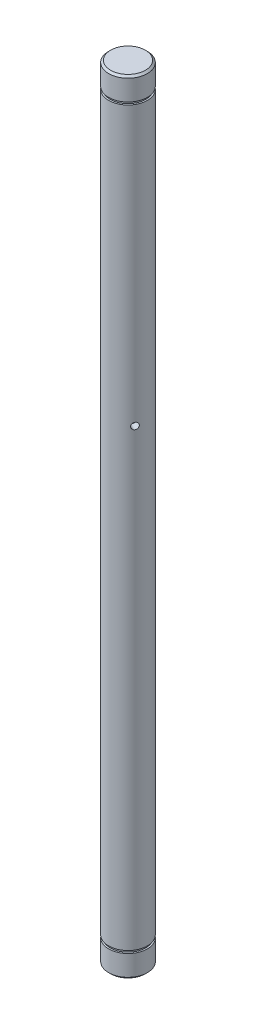
ISO-10303-21;
HEADER;
FILE_DESCRIPTION(('STEP AP214'),'2;1');
FILE_NAME('part.step','',(''),(''),'','','');
FILE_SCHEMA(('AUTOMOTIVE_DESIGN { 1 0 10303 214 1 1 1 1 }'));
ENDSEC;
DATA;
#1=APPLICATION_CONTEXT('core data for automotive mechanical design processes');
#2=APPLICATION_PROTOCOL_DEFINITION('international standard','automotive_design',2000,#1);
#3=PRODUCT_CONTEXT('',#1,'mechanical');
#4=PRODUCT('Part','Part','',(#3));
#5=PRODUCT_RELATED_PRODUCT_CATEGORY('part','',(#4));
#6=PRODUCT_DEFINITION_FORMATION('','',#4);
#7=PRODUCT_DEFINITION_CONTEXT('part definition',#1,'design');
#8=PRODUCT_DEFINITION('design','',#6,#7);
#9=PRODUCT_DEFINITION_SHAPE('','',#8);
#10=(LENGTH_UNIT() NAMED_UNIT(*) SI_UNIT(.MILLI.,.METRE.));
#11=(NAMED_UNIT(*) PLANE_ANGLE_UNIT() SI_UNIT($,.RADIAN.));
#12=(NAMED_UNIT(*) SI_UNIT($,.STERADIAN.) SOLID_ANGLE_UNIT());
#13=UNCERTAINTY_MEASURE_WITH_UNIT(LENGTH_MEASURE(1.E-05),#10,'distance_accuracy_value','');
#14=(GEOMETRIC_REPRESENTATION_CONTEXT(3) GLOBAL_UNCERTAINTY_ASSIGNED_CONTEXT((#13)) GLOBAL_UNIT_ASSIGNED_CONTEXT((#10,
#11,#12)) REPRESENTATION_CONTEXT('',''));
#15=CARTESIAN_POINT('',(0.,0.,0.));
#16=DIRECTION('',(0.,0.,1.));
#17=DIRECTION('',(1.,0.,0.));
#18=AXIS2_PLACEMENT_3D('',#15,#16,#17);
#19=CARTESIAN_POINT('',(0.,0.,0.));
#20=DIRECTION('',(0.,1.,0.));
#21=DIRECTION('',(0.,0.,1.));
#22=AXIS2_PLACEMENT_3D('',#19,#20,#21);
#23=PLANE('',#22);
#24=CARTESIAN_POINT('',(0.,0.,0.));
#25=DIRECTION('',(0.,1.,0.));
#26=DIRECTION('',(0.,0.,1.));
#27=AXIS2_PLACEMENT_3D('',#24,#25,#26);
#28=CIRCLE('',#27,30.);
#29=CARTESIAN_POINT('',(0.,0.,30.));
#30=VERTEX_POINT('',#29);
#31=EDGE_CURVE('E133',#30,#30,#28,.T.);
#32=ORIENTED_EDGE('',*,*,#31,.F.);
#33=EDGE_LOOP('',(#32));
#34=FACE_BOUND('',#33,.T.);
#35=CARTESIAN_POINT('',(0.,0.,0.));
#36=DIRECTION('',(0.,1.,0.));
#37=DIRECTION('',(0.,0.,1.));
#38=AXIS2_PLACEMENT_3D('',#35,#36,#37);
#39=CIRCLE('',#38,27.5);
#40=CARTESIAN_POINT('',(0.,0.,27.5));
#41=VERTEX_POINT('',#40);
#42=EDGE_CURVE('E136',#41,#41,#39,.F.);
#43=ORIENTED_EDGE('',*,*,#42,.F.);
#44=EDGE_LOOP('',(#43));
#45=FACE_BOUND('',#44,.T.);
#46=ADVANCED_FACE('F47',(#34,#45),#23,.F.);
#47=CARTESIAN_POINT('',(0.,1136.,0.));
#48=DIRECTION('',(0.,1.,0.));
#49=DIRECTION('',(0.,0.,1.));
#50=AXIS2_PLACEMENT_3D('',#47,#48,#49);
#51=PLANE('',#50);
#52=CARTESIAN_POINT('',(0.,1136.,0.));
#53=DIRECTION('',(0.,1.,0.));
#54=DIRECTION('',(0.,0.,1.));
#55=AXIS2_PLACEMENT_3D('',#52,#53,#54);
#56=CIRCLE('',#55,30.);
#57=CARTESIAN_POINT('',(0.,1136.,30.));
#58=VERTEX_POINT('',#57);
#59=EDGE_CURVE('E152',#58,#58,#56,.T.);
#60=ORIENTED_EDGE('',*,*,#59,.T.);
#61=EDGE_LOOP('',(#60));
#62=FACE_BOUND('',#61,.T.);
#63=CARTESIAN_POINT('',(0.,1136.,0.));
#64=DIRECTION('',(0.,1.,0.));
#65=DIRECTION('',(0.,0.,1.));
#66=AXIS2_PLACEMENT_3D('',#63,#64,#65);
#67=CIRCLE('',#66,27.5);
#68=CARTESIAN_POINT('',(0.,1136.,27.5));
#69=VERTEX_POINT('',#68);
#70=EDGE_CURVE('E159',#69,#69,#67,.T.);
#71=ORIENTED_EDGE('',*,*,#70,.F.);
#72=EDGE_LOOP('',(#71));
#73=FACE_BOUND('',#72,.T.);
#74=ADVANCED_FACE('F123',(#62,#73),#51,.T.);
#75=CARTESIAN_POINT('',(0.,1136.,0.));
#76=DIRECTION('',(0.,-1.,0.));
#77=DIRECTION('',(0.,0.,-1.));
#78=AXIS2_PLACEMENT_3D('',#75,#76,#77);
#79=CYLINDRICAL_SURFACE('',#78,30.);
#80=CARTESIAN_POINT('',(-28.1173769148991,704.,10.4600724388266));
#81=CARTESIAN_POINT('',(-28.1173771397621,704.139423603737,10.4600700835881));
#82=CARTESIAN_POINT('',(-28.1153154961193,704.278818119642,10.4656182223383));
#83=CARTESIAN_POINT('',(-28.1070662950376,704.556647973375,10.4877534809213));
#84=CARTESIAN_POINT('',(-28.1008779201333,704.695083115672,10.5043427879009));
#85=CARTESIAN_POINT('',(-28.0843622211793,704.970042647517,10.5484192698075));
#86=CARTESIAN_POINT('',(-28.074032277628,705.106565771066,10.575913341773));
#87=CARTESIAN_POINT('',(-28.049218807801,705.37669662622,10.6415485140674));
#88=CARTESIAN_POINT('',(-28.0347337562979,705.51030326785,10.6796935239296));
#89=CARTESIAN_POINT('',(-28.0016198934632,705.773448710067,10.7662168005944));
#90=CARTESIAN_POINT('',(-27.9829961425169,705.902992259731,10.8145825669706));
#91=CARTESIAN_POINT('',(-27.9415760812531,706.15733240147,10.9211534819725));
#92=CARTESIAN_POINT('',(-27.9187782327634,706.282127223076,10.9793622571814));
#93=CARTESIAN_POINT('',(-27.8690196307265,706.526005513904,11.1050578066721));
#94=CARTESIAN_POINT('',(-27.8420609410916,706.645091776581,11.1725399792376));
#95=CARTESIAN_POINT('',(-27.7839623524447,706.876856596855,11.3162468388056));
#96=CARTESIAN_POINT('',(-27.7528208981121,706.989532748623,11.3924747762911));
#97=CARTESIAN_POINT('',(-27.6860963493674,707.208594812923,11.5536894984017));
#98=CARTESIAN_POINT('',(-27.6504779150396,707.314919461355,11.6387449127783));
#99=CARTESIAN_POINT('',(-27.5750282238392,707.51954322098,11.8163925139151));
#100=CARTESIAN_POINT('',(-27.5351954120298,707.617839346099,11.9089874795451));
#101=CARTESIAN_POINT('',(-27.4513977901698,707.805657533116,12.1008973195375));
#102=CARTESIAN_POINT('',(-27.4074342539555,707.895182282655,12.2002101196199));
#103=CARTESIAN_POINT('',(-27.3154369440261,708.064900836917,12.4048171685183));
#104=CARTESIAN_POINT('',(-27.267401675745,708.145091189509,12.5101136089683));
#105=CARTESIAN_POINT('',(-27.1671205214253,708.295958859091,12.726423268344));
#106=CARTESIAN_POINT('',(-27.1148524987269,708.366580207992,12.8374652776788));
#107=CARTESIAN_POINT('',(-27.0064999606255,708.497283997133,13.0638707491688));
#108=CARTESIAN_POINT('',(-26.9504140304243,708.55736250069,13.1792358061143));
#109=CARTESIAN_POINT('',(-26.8346876803736,708.666477763349,13.4132976195951));
#110=CARTESIAN_POINT('',(-26.7750487679081,708.715519163438,13.5319929520824));
#111=CARTESIAN_POINT('',(-26.6524837964453,708.802233243124,13.7718302990876));
#112=CARTESIAN_POINT('',(-26.5895565465591,708.839901770029,13.8929731901226));
#113=CARTESIAN_POINT('',(-26.3975654474215,708.934730968945,14.2563210738316));
#114=CARTESIAN_POINT('',(-26.2640870154114,708.974851340937,14.5008946340737));
#115=CARTESIAN_POINT('',(-25.9889460620215,709.007845998392,14.9884345239502));
#116=CARTESIAN_POINT('',(-25.847284097569,709.000723495206,15.2314009617054));
#117=CARTESIAN_POINT('',(-25.5613194399288,708.93983347051,15.7065286780251));
#118=CARTESIAN_POINT('',(-25.417056799268,708.886528647719,15.9387731420613));
#119=CARTESIAN_POINT('',(-25.1292447204363,708.735498877001,16.38879098969));
#120=CARTESIAN_POINT('',(-24.9856953041217,708.637772576192,16.6065639323125));
#121=CARTESIAN_POINT('',(-24.7037002612635,708.400218442737,17.0232438315057));
#122=CARTESIAN_POINT('',(-24.565281010844,708.260199901679,17.2220598475132));
#123=CARTESIAN_POINT('',(-24.2994442460484,707.942174428892,17.5951575255927));
#124=CARTESIAN_POINT('',(-24.172027623274,707.764164422561,17.7694372000739));
#125=CARTESIAN_POINT('',(-23.9318221045898,707.372642366536,18.0916789175705));
#126=CARTESIAN_POINT('',(-23.8192294271272,707.158725804778,18.2392960219377));
#127=CARTESIAN_POINT('',(-23.6153894305837,706.702825824988,18.5024640594764));
#128=CARTESIAN_POINT('',(-23.5241423084,706.460842148089,18.6180146968601));
#129=CARTESIAN_POINT('',(-23.3671044629859,705.955216714788,18.8147380261745));
#130=CARTESIAN_POINT('',(-23.3013423671612,705.691551003419,18.895872067459));
#131=CARTESIAN_POINT('',(-23.1986417075643,705.150301855782,19.0218214436721));
#132=CARTESIAN_POINT('',(-23.1617006058695,704.872719647267,19.0666399764895));
#133=CARTESIAN_POINT('',(-23.1187743560316,704.315067687545,19.1186665834963));
#134=CARTESIAN_POINT('',(-23.1124247621333,704.035067240464,19.1263174562954));
#135=CARTESIAN_POINT('',(-23.1300136382236,703.47742665675,19.1050425900537));
#136=CARTESIAN_POINT('',(-23.1539509383509,703.199786429368,19.0761182637662));
#137=CARTESIAN_POINT('',(-23.2306600070055,702.656544481224,18.982624073034));
#138=CARTESIAN_POINT('',(-23.283248421867,702.390877718802,18.9182808460333));
#139=CARTESIAN_POINT('',(-23.4146068605827,701.877059668882,18.7554541972191));
#140=CARTESIAN_POINT('',(-23.4933784506708,701.62890943027,18.6569687330587));
#141=CARTESIAN_POINT('',(-23.6743391001918,701.154650805766,18.4268069833502));
#142=CARTESIAN_POINT('',(-23.776737449646,700.928766834168,18.2948329402466));
#143=CARTESIAN_POINT('',(-24.0000581233705,700.50777295493,18.0008665956645));
#144=CARTESIAN_POINT('',(-24.120981750464,700.312665213643,17.8388721827818));
#145=CARTESIAN_POINT('',(-24.377697981186,699.95669613789,17.4864454748031));
#146=CARTESIAN_POINT('',(-24.5136321401894,699.796212059973,17.2957349528953));
#147=CARTESIAN_POINT('',(-24.793921456369,699.516689633438,16.8914725720526));
#148=CARTESIAN_POINT('',(-24.9382763409755,699.397649944178,16.6779214522566));
#149=CARTESIAN_POINT('',(-25.2293304878866,699.204977763684,16.2342529875916));
#150=CARTESIAN_POINT('',(-25.3760166470502,699.131147869228,16.0042126336008));
#151=CARTESIAN_POINT('',(-25.6673459155002,699.030372781046,15.5326727286569));
#152=CARTESIAN_POINT('',(-25.8119891919217,699.003423729547,15.291174122271));
#153=CARTESIAN_POINT('',(-26.0229683053729,698.998760998337,14.9273136475803));
#154=CARTESIAN_POINT('',(-26.0919266277213,699.003044749962,14.8064405525936));
#155=CARTESIAN_POINT('',(-26.2277451907741,699.023188200833,14.5644964575808));
#156=CARTESIAN_POINT('',(-26.2946062097499,699.039043551774,14.4434255489345));
#157=CARTESIAN_POINT('',(-26.4258234126245,699.082221698765,14.2019283579838));
#158=CARTESIAN_POINT('',(-26.4901786977764,699.109548568718,14.081502320096));
#159=CARTESIAN_POINT('',(-26.6159696800007,699.175447362096,13.8422689954559));
#160=CARTESIAN_POINT('',(-26.6774064198773,699.214015233396,13.7234611415108));
#161=CARTESIAN_POINT('',(-26.7970190161255,699.302077973703,13.4884080389413));
#162=CARTESIAN_POINT('',(-26.8551973345269,699.35156444916,13.3721608968909));
#163=CARTESIAN_POINT('',(-26.9680617099611,699.461098663884,13.1430571077036));
#164=CARTESIAN_POINT('',(-27.0227490094441,699.521142616866,13.0301992619779));
#165=CARTESIAN_POINT('',(-27.1284645346661,699.651398887662,12.8086488495665));
#166=CARTESIAN_POINT('',(-27.1794913207336,699.721615173802,12.6999579294634));
#167=CARTESIAN_POINT('',(-27.2776823520119,699.871678447901,12.4876627516737));
#168=CARTESIAN_POINT('',(-27.3248479463556,699.951522047673,12.3840567223948));
#169=CARTESIAN_POINT('',(-27.4157517080668,700.121309553664,12.181503544552));
#170=CARTESIAN_POINT('',(-27.4594427277418,700.211361773312,12.0826260108138));
#171=CARTESIAN_POINT('',(-27.5426662818894,700.40012486888,11.8916936769868));
#172=CARTESIAN_POINT('',(-27.5822002957536,700.498832641378,11.7996364531611));
#173=CARTESIAN_POINT('',(-27.6570950838605,700.704319329494,11.6230074192319));
#174=CARTESIAN_POINT('',(-27.6924533422681,700.811103047852,11.5384401293043));
#175=CARTESIAN_POINT('',(-27.7589258657098,701.031918455747,11.3775923356185));
#176=CARTESIAN_POINT('',(-27.7900416908366,701.1459474582,11.3013087877473));
#177=CARTESIAN_POINT('',(-27.8482490150197,701.381386563711,11.1571107405415));
#178=CARTESIAN_POINT('',(-27.8753087304166,701.502845422524,11.0892629843005));
#179=CARTESIAN_POINT('',(-27.9251142919067,701.751469348351,10.9632377929559));
#180=CARTESIAN_POINT('',(-27.947861725512,701.878632294075,10.9050568001337));
#181=CARTESIAN_POINT('',(-27.9890492327678,702.13772401246,10.7989057975286));
#182=CARTESIAN_POINT('',(-28.0074923077489,702.269649389826,10.750928674904));
#183=CARTESIAN_POINT('',(-28.040098447941,702.53736024269,10.6655969650576));
#184=CARTESIAN_POINT('',(-28.0542624333496,702.673144881391,10.6282400941039));
#185=CARTESIAN_POINT('',(-28.0833329881821,703.004722074579,10.5512454489213));
#186=CARTESIAN_POINT('',(-28.096103532764,703.202009403498,10.5171074188714));
#187=CARTESIAN_POINT('',(-28.1131252573556,703.599551181298,10.471522810703));
#188=CARTESIAN_POINT('',(-28.1173765920247,703.799805576248,10.4600758206472));
#189=CARTESIAN_POINT('',(-28.1173769148991,704.,10.4600724388266));
#190=B_SPLINE_CURVE_WITH_KNOTS('',3,(#80,#81,#82,#83,#84,#85,#86,#87,#88,#89,#90,#91,#92,#93,
#94,#95,#96,#97,#98,#99,#100,#101,#102,#103,#104,#105,#106,#107,#108,#109,#110,#111,#112,#113,
#114,#115,#116,#117,#118,#119,#120,#121,#122,#123,#124,#125,#126,#127,#128,#129,#130,#131,#132,
#133,#134,#135,#136,#137,#138,#139,#140,#141,#142,#143,#144,#145,#146,#147,#148,#149,#150,#151,
#152,#153,#154,#155,#156,#157,#158,#159,#160,#161,#162,#163,#164,#165,#166,#167,#168,#169,#170,
#171,#172,#173,#174,#175,#176,#177,#178,#179,#180,#181,#182,#183,#184,#185,#186,#187,#188,#189),
.UNSPECIFIED.,.T.,.F.,(4,2,2,2,2,2,2,2,2,2,2,2,2,2,2,2,2,2,2,2,2,2,2,2,2,2,2,2,2,2,2,2,2,2,2,2,
2,2,2,2,2,2,2,2,2,2,2,2,2,2,2,2,2,2,4),(0.,0.418095242549796,0.836273330312904,1.25471632992765,
1.67331312559434,2.09140089204113,2.50964303678572,2.92767838265878,3.34586960348915,
3.76759791918763,4.18948238202718,4.61123716813961,5.0331474391343,5.45742771408347,
5.88186607917442,6.30612563749768,6.73053992314502,7.57061257037406,8.4106281139766,
9.24232364421611,10.0740445059134,10.9095733037112,11.745169745458,12.5909036901652,
13.436645435843,14.2833344708947,15.1299489396842,15.9664520693309,16.8029228892024,
17.6341025136326,18.4653318667943,19.3042280761769,20.1431833095366,20.9908634816304,
21.8385162304567,22.6824409092757,23.5262961391698,23.9435677338949,24.3606826095272,
24.7779457414127,25.1950586450547,25.6118520083924,26.0284961987167,26.4453033659294,
26.8619642700312,27.2835543146455,27.7049938127194,28.1266859407459,28.5482225769884,
28.9729067446496,29.3974342652836,29.8216648822649,30.2458042054463,30.8461462814326,
31.4464774585936),.UNSPECIFIED.);
#191=CARTESIAN_POINT('',(-28.1173769148991,704.,10.4600724388266));
#192=VERTEX_POINT('',#191);
#193=EDGE_CURVE('E51',#192,#192,#190,.T.);
#194=ORIENTED_EDGE('',*,*,#193,.T.);
#195=EDGE_LOOP('',(#194));
#196=FACE_BOUND('',#195,.T.);
#197=CARTESIAN_POINT('',(23.1173769148989,704.,19.1203264766713));
#198=CARTESIAN_POINT('',(23.117374987634,704.139423603737,19.1203278490276));
#199=CARTESIAN_POINT('',(23.121148994914,704.278818119642,19.1157683438844));
#200=CARTESIAN_POINT('',(23.1361940906254,704.556647973375,19.0975566968952));
#201=CARTESIAN_POINT('',(23.1474666644488,704.695083115672,19.0839027535301));
#202=CARTESIAN_POINT('',(23.1773801680123,704.970042647516,19.0475614977214));
#203=CARTESIAN_POINT('',(23.1960257610123,705.106565771066,19.0248684682036));
#204=CARTESIAN_POINT('',(23.2404607526875,705.37669662622,18.9705617868301));
#205=CARTESIAN_POINT('',(23.2662527745042,705.51030326785,18.9389448593222));
#206=CARTESIAN_POINT('',(23.3246271986973,705.773448710067,18.8670057745575));
#207=CARTESIAN_POINT('',(23.3572013055793,705.902992259731,18.8266942499362));
#208=CARTESIAN_POINT('',(23.4287843946436,706.15733240147,18.7375379671545));
#209=CARTESIAN_POINT('',(23.4677957484529,706.282127223076,18.6886900636063));
#210=CARTESIAN_POINT('',(23.551771986436,706.526005513904,18.5827500754402));
#211=CARTESIAN_POINT('',(23.596733917363,706.645091776581,18.5256620790809));
#212=CARTESIAN_POINT('',(23.6921384141234,706.876856596855,18.4034937956047));
#213=CARTESIAN_POINT('',(23.7425830172977,706.989532748623,18.3384105362991));
#214=CARTESIAN_POINT('',(23.8488367877371,707.208594812923,18.2000180209748));
#215=CARTESIAN_POINT('',(23.9046877201528,707.314919461355,18.1266438448156));
#216=CARTESIAN_POINT('',(24.0208102100585,707.51954322098,17.97247869496));
#217=CARTESIAN_POINT('',(24.0810833966518,707.617839346099,17.8916849852139));
#218=CARTESIAN_POINT('',(24.2053833823914,707.805657533116,17.7231591959102));
#219=CARTESIAN_POINT('',(24.2694090220766,707.895182282655,17.6354292566672));
#220=CARTESIAN_POINT('',(24.4006052692513,708.064900836917,17.4534537247393));
#221=CARTESIAN_POINT('',(24.4677770274685,708.145091189509,17.3592057419053));
#222=CARTESIAN_POINT('',(24.604966110412,708.295958859091,17.1642048850557));
#223=CARTESIAN_POINT('',(24.674997300034,708.366580207992,17.0634184449259));
#224=CARTESIAN_POINT('',(24.8168939208494,708.497283997133,16.8563796586206));
#225=CARTESIAN_POINT('',(24.8887600257728,708.55736250069,16.7501252897987));
#226=CARTESIAN_POINT('',(25.0336003272776,708.666477763349,16.5328724240272));
#227=CARTESIAN_POINT('',(25.1065740442894,708.715519163438,16.4218759445343));
#228=CARTESIAN_POINT('',(25.2529967938408,708.802233243124,16.1958128921308));
#229=CARTESIAN_POINT('',(25.3264459900219,708.839901770029,16.0807448496216));
#230=CARTESIAN_POINT('',(25.5451189381564,708.934730968945,15.7328017386135));
#231=CARTESIAN_POINT('',(25.690186638415,708.974851340937,15.4949192455143));
#232=CARTESIAN_POINT('',(25.9748380917114,709.007845998392,15.012870245319));
#233=CARTESIAN_POINT('',(26.1144222168482,709.000723495206,14.7687041664754));
#234=CARTESIAN_POINT('',(26.382912560403,708.93983347051,14.2834876502147));
#235=CARTESIAN_POINT('',(26.5119108458163,708.886528647719,14.0424303065673));
#236=CARTESIAN_POINT('',(26.7577316946033,708.735498877001,13.5681688109687));
#237=CARTESIAN_POINT('',(26.8745538870139,708.637772576192,13.3349648984306));
#238=CARTESIAN_POINT('',(27.0944117435325,708.400218442737,12.8824100779775));
#239=CARTESIAN_POINT('',(27.1973818388645,708.260199901679,12.6631274827377));
#240=CARTESIAN_POINT('',(27.3875755237765,707.942174428892,12.246357252125));
#241=CARTESIAN_POINT('',(27.4747978378533,707.764164422561,12.0488713826974));
#242=CARTESIAN_POINT('',(27.6337645920224,707.372642366536,11.6797264426393));
#243=CARTESIAN_POINT('',(27.7053084157061,707.158725804778,11.508409771493));
#244=CARTESIAN_POINT('',(27.831298623407,706.702825824988,11.2002951374097));
#245=CARTESIAN_POINT('',(27.8857448497129,706.460842148089,11.0634974928846));
#246=CARTESIAN_POINT('',(27.9775933277092,705.955216714788,10.8291370647432));
#247=CARTESIAN_POINT('',(28.0149764206609,705.691551003419,10.7316183985107));
#248=CARTESIAN_POINT('',(28.0727014502538,705.150301855782,10.5797023302078));
#249=CARTESIAN_POINT('',(28.0930448873866,704.872719647267,10.5253011312876));
#250=CARTESIAN_POINT('',(28.1166381258083,704.315067687545,10.4621126049353));
#251=CARTESIAN_POINT('',(28.1200891790643,704.035067240464,10.4527882589161));
#252=CARTESIAN_POINT('',(28.110459042482,703.47742665675,10.4786581055552));
#253=CARTESIAN_POINT('',(28.0973784911933,703.199786429368,10.5138505787072));
#254=CARTESIAN_POINT('',(28.0547646812403,702.656544481224,10.6270296762289));
#255=CARTESIAN_POINT('',(28.025336019527,702.390877718802,10.704744192944));
#256=CARTESIAN_POINT('',(27.9500032245986,701.877059668882,10.8999172622803));
#257=CARTESIAN_POINT('',(27.9040981057763,701.62890943027,11.0173781924733));
#258=CARTESIAN_POINT('',(27.7952525083097,701.154650805766,11.2891755868981));
#259=CARTESIAN_POINT('',(27.732158809069,700.928766834168,11.4438421803828));
#260=CARTESIAN_POINT('',(27.5892368236655,700.507772954931,11.7842267293095));
#261=CARTESIAN_POINT('',(27.5094073603846,700.312665213644,11.9699468687316));
#262=CARTESIAN_POINT('',(27.332554993664,699.95669613789,12.36848300009));
#263=CARTESIAN_POINT('',(27.2353619164245,699.796212059973,12.581560695983));
#264=CARTESIAN_POINT('',(27.0254050829102,699.516689633438,13.0264295546252));
#265=CARTESIAN_POINT('',(26.9126418304635,699.397649944178,13.2582201117528));
#266=CARTESIAN_POINT('',(26.6739407426611,699.204977763684,13.7321146291871));
#267=CARTESIAN_POINT('',(26.5480630317913,699.131147869228,13.9741687464017));
#268=CARTESIAN_POINT('',(26.2853621294368,699.030372781046,14.4622372462174));
#269=CARTESIAN_POINT('',(26.1485398395388,699.003423729547,14.7082513012779));
#270=CARTESIAN_POINT('',(25.9389169817492,698.998760998337,15.07289481054));
#271=CARTESIAN_POINT('',(25.8687169720308,699.003044749962,15.1930510169894));
#272=CARTESIAN_POINT('',(25.7270965209806,699.023188200833,15.431645390405));
#273=CARTESIAN_POINT('',(25.6556765479215,699.039043551774,15.5500841856841));
#274=CARTESIAN_POINT('',(25.512142447053,699.082221698765,15.7844702122624));
#275=CARTESIAN_POINT('',(25.440028081541,699.109548568718,15.9004165430157));
#276=CARTESIAN_POINT('',(25.2957414360829,699.175447362096,16.1289713915089));
#277=CARTESIAN_POINT('',(25.2235691863357,699.214015233396,16.2415810959403));
#278=CARTESIAN_POINT('',(25.0798135263963,699.302077973703,16.4626951941886));
#279=CARTESIAN_POINT('',(25.008229707464,699.35156444916,16.5712026668989));
#280=CARTESIAN_POINT('',(24.8662521936416,699.461098663884,16.7834979778008));
#281=CARTESIAN_POINT('',(24.7958580819682,699.521142616866,16.8872874912803));
#282=CARTESIAN_POINT('',(24.6568475592121,699.651398887662,17.0896150279027));
#283=CARTESIAN_POINT('',(24.5882318542757,699.721615173803,17.1881509809622));
#284=CARTESIAN_POINT('',(24.4534743528481,699.871678447901,17.3793344973678));
#285=CARTESIAN_POINT('',(24.3873316966792,699.951522047673,17.4719841148935));
#286=CARTESIAN_POINT('',(24.2573673799057,700.121309553664,17.6519856707563));
#287=CARTESIAN_POINT('',(24.1935824336623,700.211361773312,17.7392619705813));
#288=CARTESIAN_POINT('',(24.0698419592382,700.40012486888,17.9068018495798));
#289=CARTESIAN_POINT('',(24.0098850717353,700.498832641378,17.9870679218126));
#290=CARTESIAN_POINT('',(23.8943672353601,700.704319329494,18.1402432278889));
#291=CARTESIAN_POINT('',(23.8388089431574,700.811103047852,18.2131480228672));
#292=CARTESIAN_POINT('',(23.7327469294037,701.031918455747,18.3511388136642));
#293=CARTESIAN_POINT('',(23.6822413516199,701.1459474582,18.4162276826194));
#294=CARTESIAN_POINT('',(23.5864658416551,701.381386563711,18.5387357276512));
#295=CARTESIAN_POINT('',(23.541237818859,701.502845422524,18.5960940067246));
#296=CARTESIAN_POINT('',(23.4569995823829,701.751469348351,18.702239483897));
#297=CARTESIAN_POINT('',(23.4179870813841,701.878632294075,18.7510298356813));
#298=CARTESIAN_POINT('',(23.3466513701187,702.13772401246,18.8397747645859));
#299=CARTESIAN_POINT('',(23.3143235006159,702.269649389826,18.8797354973557));
#300=CARTESIAN_POINT('',(23.2567271422367,702.53736024269,18.9506390980046));
#301=CARTESIAN_POINT('',(23.2314571356892,702.673144881391,18.9815839046642));
#302=CARTESIAN_POINT('',(23.1793130944219,703.004722074579,19.0452570662425));
#303=CARTESIAN_POINT('',(23.1561339654545,703.202009403498,19.0733856972955));
#304=CARTESIAN_POINT('',(23.125167399055,703.599551181298,19.1109192472922));
#305=CARTESIAN_POINT('',(23.1173796822043,703.799805576248,19.1203245061436));
#306=CARTESIAN_POINT('',(23.1173769148989,704.,19.1203264766713));
#307=B_SPLINE_CURVE_WITH_KNOTS('',3,(#197,#198,#199,#200,#201,#202,#203,#204,#205,#206,#207,
#208,#209,#210,#211,#212,#213,#214,#215,#216,#217,#218,#219,#220,#221,#222,#223,#224,#225,#226,
#227,#228,#229,#230,#231,#232,#233,#234,#235,#236,#237,#238,#239,#240,#241,#242,#243,#244,#245,
#246,#247,#248,#249,#250,#251,#252,#253,#254,#255,#256,#257,#258,#259,#260,#261,#262,#263,#264,
#265,#266,#267,#268,#269,#270,#271,#272,#273,#274,#275,#276,#277,#278,#279,#280,#281,#282,#283,
#284,#285,#286,#287,#288,#289,#290,#291,#292,#293,#294,#295,#296,#297,#298,#299,#300,#301,#302,
#303,#304,#305,#306),.UNSPECIFIED.,.T.,.F.,(4,2,2,2,2,2,2,2,2,2,2,2,2,2,2,2,2,2,2,2,2,2,2,2,2,2,
2,2,2,2,2,2,2,2,2,2,2,2,2,2,2,2,2,2,2,2,2,2,2,2,2,2,2,2,4),(0.,0.418095242549796,
0.836273330312904,1.25471632992753,1.67331312559434,2.09140089204101,2.50964303678572,
2.92767838265878,3.34586960348915,3.76759791918763,4.18948238202718,4.61123716813961,
5.0331474391343,5.45742771408347,5.88186607917442,6.30612563749768,6.73053992314502,
7.57061257037406,8.4106281139766,9.24232364421611,10.0740445059134,10.9095733037112,
11.745169745458,12.5909036901652,13.436645435843,14.2833344708947,15.1299489396842,
15.966452069331,16.8029228892024,17.6341025136326,18.4653318667943,19.3042280761767,
20.1431833095366,20.9908634816304,21.8385162304567,22.6824409092757,23.5262961391698,
23.9435677338949,24.3606826095272,24.7779457414127,25.1950586450547,25.6118520083924,
26.0284961987168,26.4453033659294,26.8619642700312,27.2835543146455,27.7049938127194,
28.1266859407459,28.5482225769884,28.9729067446498,29.3974342652837,29.8216648822649,
30.2458042054463,30.8461462814326,31.4464774585936),.UNSPECIFIED.);
#308=CARTESIAN_POINT('',(23.1173769148989,704.,19.1203264766713));
#309=VERTEX_POINT('',#308);
#310=EDGE_CURVE('E75',#309,#309,#307,.T.);
#311=ORIENTED_EDGE('',*,*,#310,.T.);
#312=EDGE_LOOP('',(#311));
#313=FACE_BOUND('',#312,.T.);
#314=CARTESIAN_POINT('',(0.,709.,-30.));
#315=CARTESIAN_POINT('',(-0.139438730306522,709.000002148603,-30.0000009341092));
#316=CARTESIAN_POINT('',(-0.278848374995368,708.994165244351,-29.9990260400444));
#317=CARTESIAN_POINT('',(-0.556708896140989,708.970865816497,-29.9951557115238));
#318=CARTESIAN_POINT('',(-0.695159577308853,708.953400991396,-29.9922598968632));
#319=CARTESIAN_POINT('',(-0.970150520344171,708.906961187102,-29.9846251699259));
#320=CARTESIAN_POINT('',(-1.10668952072418,708.877978947068,-29.979885095025));
#321=CARTESIAN_POINT('',(-1.37685247096437,708.808713944594,-29.9686930297133));
#322=CARTESIAN_POINT('',(-1.5104753317869,708.768427035683,-29.9622404112013));
#323=CARTESIAN_POINT('',(-1.773655280857,708.676914998639,-29.9478128865369));
#324=CARTESIAN_POINT('',(-1.90321704710933,708.625703029322,-29.9398398129292));
#325=CARTESIAN_POINT('',(-2.15759207174615,708.512668231626,-29.9225843720657));
#326=CARTESIAN_POINT('',(-2.28240355940393,708.450841492879,-29.9133015225275));
#327=CARTESIAN_POINT('',(-2.52631223217172,708.317068887617,-29.8936901460056));
#328=CARTESIAN_POINT('',(-2.64541222152925,708.245128056601,-29.8833621400859));
#329=CARTESIAN_POINT('',(-2.87720075943644,708.091582677577,-29.8619368035706));
#330=CARTESIAN_POINT('',(-2.98988690101176,708.009974536583,-29.8508391875783));
#331=CARTESIAN_POINT('',(-3.20893550320275,707.836974048339,-29.8280901061561));
#332=CARTESIAN_POINT('',(-3.31523860199373,707.745507029646,-29.8164348485225));
#333=CARTESIAN_POINT('',(-3.51981905081328,707.553944106272,-29.792977049997));
#334=CARTESIAN_POINT('',(-3.61809341494841,707.453845019509,-29.7811744561748));
#335=CARTESIAN_POINT('',(-3.805869004684,707.245765565729,-29.757760553176));
#336=CARTESIAN_POINT('',(-3.89537288715651,707.137787602886,-29.7461491869625));
#337=CARTESIAN_POINT('',(-4.06505128766864,706.91462075741,-29.7234367117224));
#338=CARTESIAN_POINT('',(-4.14522235269036,706.799429229943,-29.7123357924676));
#339=CARTESIAN_POINT('',(-4.29606801839331,706.561971474694,-29.6909016370194));
#340=CARTESIAN_POINT('',(-4.36668480543053,706.439668068223,-29.6805732300208));
#341=CARTESIAN_POINT('',(-4.49737903615678,706.189410913351,-29.6610510502017));
#342=CARTESIAN_POINT('',(-4.55745254274489,706.061455076435,-29.6518577016161));
#343=CARTESIAN_POINT('',(-4.66655756396111,705.800880688985,-29.6348831234285));
#344=CARTESIAN_POINT('',(-4.71559374278069,705.668264135488,-29.6271012976113));
#345=CARTESIAN_POINT('',(-4.80229722760728,705.399267690265,-29.6131700678879));
#346=CARTESIAN_POINT('',(-4.83996038282925,705.262886444321,-29.6070212600786));
#347=CARTESIAN_POINT('',(-4.93477467758658,704.852198524144,-29.5914227981395));
#348=CARTESIAN_POINT('',(-4.97488357358492,704.57363113463,-29.5846386003063));
#349=CARTESIAN_POINT('',(-5.00784793424048,704.013796841615,-29.5790755483693));
#350=CARTESIAN_POINT('',(-5.00070674304215,703.732530130568,-29.5802961277241));
#351=CARTESIAN_POINT('',(-4.93978637434363,703.178155521427,-29.590529429811));
#352=CARTESIAN_POINT('',(-4.88648873937527,702.90499340626,-29.5994616948564));
#353=CARTESIAN_POINT('',(-4.73550730524634,702.371554350887,-29.6239896757343));
#354=CARTESIAN_POINT('',(-4.63782198375658,702.111277852948,-29.6395856201047));
#355=CARTESIAN_POINT('',(-4.40035421574883,701.609543166281,-29.6757696483376));
#356=CARTESIAN_POINT('',(-4.26037175365461,701.368181405821,-29.6963813586744));
#357=CARTESIAN_POINT('',(-3.94242410922567,700.912190980922,-29.7402583517709));
#358=CARTESIAN_POINT('',(-3.76445586128011,700.697564476344,-29.7635238486315));
#359=CARTESIAN_POINT('',(-3.37296440409904,700.298347887859,-29.8104405621052));
#360=CARTESIAN_POINT('',(-3.15902792232793,700.11416297885,-29.8340929858412));
#361=CARTESIAN_POINT('',(-2.7030705033817,699.784244458738,-29.8788520267263));
#362=CARTESIAN_POINT('',(-2.46104938526713,699.638511095385,-29.8999586274719));
#363=CARTESIAN_POINT('',(-1.95541183087795,699.38959554998,-29.9372778581815));
#364=CARTESIAN_POINT('',(-1.69177745073242,699.286449162396,-29.9534863682324));
#365=CARTESIAN_POINT('',(-1.15059669160236,699.12601156845,-29.9791500601698));
#366=CARTESIAN_POINT('',(-0.87305147849117,699.068716526071,-29.988605806999));
#367=CARTESIAN_POINT('',(-0.315419802472546,699.002157283059,-29.999622596864));
#368=CARTESIAN_POINT('',(-0.0354014741699571,698.992336855282,-30.0012750602153));
#369=CARTESIAN_POINT('',(0.522279545647752,699.019522689963,-29.9967494884638));
#370=CARTESIAN_POINT('',(0.799942327386613,699.056527150676,-29.9905717546544));
#371=CARTESIAN_POINT('',(1.34331235148862,699.175849694288,-29.971136538593));
#372=CARTESIAN_POINT('',(1.60908173821585,699.257892400397,-29.9579220953842));
#373=CARTESIAN_POINT('',(2.12309376827576,699.464669052783,-29.9258892897492));
#374=CARTESIAN_POINT('',(2.37133542643382,699.589405396424,-29.9070706126377));
#375=CARTESIAN_POINT('',(2.84566138437117,699.879302187699,-29.8656903236297));
#376=CARTESIAN_POINT('',(3.07153052223245,700.044810081142,-29.8430971086773));
#377=CARTESIAN_POINT('',(3.49248715064589,700.411074861979,-29.7967693569018));
#378=CARTESIAN_POINT('',(3.68757240338601,700.61183430972,-29.7730347372687));
#379=CARTESIAN_POINT('',(4.04348563611055,701.045394224035,-29.7268034705286));
#380=CARTESIAN_POINT('',(4.20393781021312,701.278505060552,-29.7043221945332));
#381=CARTESIAN_POINT('',(4.48340433261341,701.76870920865,-29.6634307237625));
#382=CARTESIAN_POINT('',(4.60241999444134,702.025801759688,-29.6450203999454));
#383=CARTESIAN_POINT('',(4.7950777335638,702.555567307277,-29.6144685973239));
#384=CARTESIAN_POINT('',(4.86890685306043,702.828170901191,-29.602301310812));
#385=CARTESIAN_POINT('',(4.96966691993878,703.382285543375,-29.5855561119601));
#386=CARTESIAN_POINT('',(4.99660194454599,703.663795815084,-29.580977539818));
#387=CARTESIAN_POINT('',(5.0012321244509,704.084409783417,-29.5801885462874));
#388=CARTESIAN_POINT('',(4.99693975789018,704.223536922024,-29.5809172344068));
#389=CARTESIAN_POINT('',(4.97678436801742,704.500912584486,-29.5843160283654));
#390=CARTESIAN_POINT('',(4.96092569221814,704.639161418785,-29.5869854047428));
#391=CARTESIAN_POINT('',(4.91774640529921,704.913847789277,-29.5941926651669));
#392=CARTESIAN_POINT('',(4.89042170080805,705.050284660635,-29.5987312164982));
#393=CARTESIAN_POINT('',(4.82453301754961,705.320296454875,-29.6095423170401));
#394=CARTESIAN_POINT('',(4.78597308458853,705.453872389426,-29.615814242021));
#395=CARTESIAN_POINT('',(4.69793428640032,705.717168605122,-29.6299071307843));
#396=CARTESIAN_POINT('',(4.64846435664853,705.846891943521,-29.6377268263817));
#397=CARTESIAN_POINT('',(4.53896986674986,706.101658726438,-29.6546930297384));
#398=CARTESIAN_POINT('',(4.47894908739063,706.226703827951,-29.6638390620139));
#399=CARTESIAN_POINT('',(4.34874498523015,706.471361450799,-29.6832065043881));
#400=CARTESIAN_POINT('',(4.27855767862004,706.590971818255,-29.6934283356131));
#401=CARTESIAN_POINT('',(4.12855715704195,706.823861525632,-29.7146554589665));
#402=CARTESIAN_POINT('',(4.04874732556532,706.937143070521,-29.7256604751555));
#403=CARTESIAN_POINT('',(3.87899685367999,707.158008698702,-29.7482907408856));
#404=CARTESIAN_POINT('',(3.78894418512201,707.265506090104,-29.7599219326499));
#405=CARTESIAN_POINT('',(3.60017574898993,707.472513396479,-29.783347263822));
#406=CARTESIAN_POINT('',(3.50146308651915,707.572026150096,-29.7951413435574));
#407=CARTESIAN_POINT('',(3.29596225179813,707.762481929977,-29.8185735949796));
#408=CARTESIAN_POINT('',(3.1891692976662,707.853419809031,-29.8302116694714));
#409=CARTESIAN_POINT('',(2.96833108680548,708.025995716105,-29.8529952569281));
#410=CARTESIAN_POINT('',(2.85428852146919,708.107637164334,-29.8641409501131));
#411=CARTESIAN_POINT('',(2.61883824287211,708.26164503041,-29.8857116363867));
#412=CARTESIAN_POINT('',(2.49738284629919,708.333939398932,-29.896130775176));
#413=CARTESIAN_POINT('',(2.24876507402077,708.467996747186,-29.9158586577262));
#414=CARTESIAN_POINT('',(2.12160481976541,708.529763601416,-29.925167809621));
#415=CARTESIAN_POINT('',(1.86251821435406,708.642300706268,-29.9424090895346));
#416=CARTESIAN_POINT('',(1.73059524615483,708.693078589774,-29.950342172599));
#417=CARTESIAN_POINT('',(1.46288984328888,708.783294818895,-29.9646113279921));
#418=CARTESIAN_POINT('',(1.32710824358209,708.822735597494,-29.9709477429356));
#419=CARTESIAN_POINT('',(0.995492141379837,708.90397830117,-29.9841083147641));
#420=CARTESIAN_POINT('',(0.7981618871835,708.939943657032,-29.9900398634941));
#421=CARTESIAN_POINT('',(0.400534394814456,708.987952757799,-29.9979850016837));
#422=CARTESIAN_POINT('',(0.200237207783448,708.999996914557,-29.9999986585978));
#423=CARTESIAN_POINT('',(0.,709.,-30.));
#424=B_SPLINE_CURVE_WITH_KNOTS('',3,(#314,#315,#316,#317,#318,#319,#320,#321,#322,#323,#324,
#325,#326,#327,#328,#329,#330,#331,#332,#333,#334,#335,#336,#337,#338,#339,#340,#341,#342,#343,
#344,#345,#346,#347,#348,#349,#350,#351,#352,#353,#354,#355,#356,#357,#358,#359,#360,#361,#362,
#363,#364,#365,#366,#367,#368,#369,#370,#371,#372,#373,#374,#375,#376,#377,#378,#379,#380,#381,
#382,#383,#384,#385,#386,#387,#388,#389,#390,#391,#392,#393,#394,#395,#396,#397,#398,#399,#400,
#401,#402,#403,#404,#405,#406,#407,#408,#409,#410,#411,#412,#413,#414,#415,#416,#417,#418,#419,
#420,#421,#422,#423),.UNSPECIFIED.,.T.,.F.,(4,2,2,2,2,2,2,2,2,2,2,2,2,2,2,2,2,2,2,2,2,2,2,2,2,2,
2,2,2,2,2,2,2,2,2,2,2,2,2,2,2,2,2,2,2,2,2,2,2,2,2,2,2,2,4),(0.,0.41814067763633,
0.836364141924748,1.25485168316259,1.67349292366116,2.0916327453657,2.50992693714589,
2.92801360569264,3.34625615217359,3.76792473637703,4.18974943231201,4.61144594582077,
5.03329798883917,5.45759827861677,5.88205667621381,6.30633536657094,6.73076871826476,
7.57090272280952,8.41097726715883,9.24239161594921,10.0738344812487,10.9092723133923,
11.7447775943526,12.5906365789677,13.4365010134581,14.2830749590592,15.1295780711641,
15.9661388505691,16.8026674414583,17.6341373208695,18.4656538972624,19.3045176932817,
20.1434424418268,20.9910576208935,21.83864592826,22.6827016275766,23.5266839364735,
23.943862966713,24.3608852695983,24.7780565762498,25.1950778447662,25.6117588257789,
26.0282907967258,26.4449864317718,26.8615359724481,27.2831832626947,27.7046799813852,
28.1264281209232,28.5480205921467,28.9726903230862,29.3972034214197,29.8214207018257,
30.2455468755532,30.8460167962321,31.4464763784911),.UNSPECIFIED.);
#425=CARTESIAN_POINT('',(0.,709.,-30.));
#426=VERTEX_POINT('',#425);
#427=EDGE_CURVE('E10',#426,#426,#424,.T.);
#428=ORIENTED_EDGE('',*,*,#427,.T.);
#429=EDGE_LOOP('',(#428));
#430=FACE_BOUND('',#429,.T.);
#431=ORIENTED_EDGE('',*,*,#59,.F.);
#432=EDGE_LOOP('',(#431));
#433=FACE_BOUND('',#432,.T.);
#434=ORIENTED_EDGE('',*,*,#31,.T.);
#435=EDGE_LOOP('',(#434));
#436=FACE_BOUND('',#435,.T.);
#437=ADVANCED_FACE('F80',(#196,#313,#430,#433,#436),#79,.T.);
#438=CARTESIAN_POINT('',(0.,1140.,0.));
#439=DIRECTION('',(0.,-1.,0.));
#440=DIRECTION('',(0.,0.,-1.));
#441=AXIS2_PLACEMENT_3D('',#438,#439,#440);
#442=CYLINDRICAL_SURFACE('',#441,27.5);
#443=CARTESIAN_POINT('',(0.,1140.,0.));
#444=DIRECTION('',(0.,1.,0.));
#445=DIRECTION('',(0.,0.,1.));
#446=AXIS2_PLACEMENT_3D('',#443,#444,#445);
#447=CIRCLE('',#446,27.5);
#448=CARTESIAN_POINT('',(0.,1140.,27.5));
#449=VERTEX_POINT('',#448);
#450=EDGE_CURVE('E155',#449,#449,#447,.T.);
#451=ORIENTED_EDGE('',*,*,#450,.F.);
#452=EDGE_LOOP('',(#451));
#453=FACE_BOUND('',#452,.T.);
#454=ORIENTED_EDGE('',*,*,#70,.T.);
#455=EDGE_LOOP('',(#454));
#456=FACE_BOUND('',#455,.T.);
#457=ADVANCED_FACE('F115',(#453,#456),#442,.T.);
#458=CARTESIAN_POINT('',(0.,1140.,0.));
#459=DIRECTION('',(0.,1.,0.));
#460=DIRECTION('',(0.,0.,1.));
#461=AXIS2_PLACEMENT_3D('',#458,#459,#460);
#462=PLANE('',#461);
#463=CARTESIAN_POINT('',(0.,1140.,0.));
#464=DIRECTION('',(0.,1.,0.));
#465=DIRECTION('',(0.,0.,1.));
#466=AXIS2_PLACEMENT_3D('',#463,#464,#465);
#467=CIRCLE('',#466,30.);
#468=CARTESIAN_POINT('',(0.,1140.,30.));
#469=VERTEX_POINT('',#468);
#470=EDGE_CURVE('E163',#469,#469,#467,.T.);
#471=ORIENTED_EDGE('',*,*,#470,.F.);
#472=EDGE_LOOP('',(#471));
#473=FACE_BOUND('',#472,.T.);
#474=ORIENTED_EDGE('',*,*,#450,.T.);
#475=EDGE_LOOP('',(#474));
#476=FACE_BOUND('',#475,.T.);
#477=ADVANCED_FACE('F112',(#473,#476),#462,.F.);
#478=CARTESIAN_POINT('',(0.,1175.,0.));
#479=DIRECTION('',(0.,-1.,0.));
#480=DIRECTION('',(0.,0.,-1.));
#481=AXIS2_PLACEMENT_3D('',#478,#479,#480);
#482=CYLINDRICAL_SURFACE('',#481,30.);
#483=CARTESIAN_POINT('',(0.,1172.,0.));
#484=DIRECTION('',(0.,1.,0.));
#485=DIRECTION('',(0.,0.,1.));
#486=AXIS2_PLACEMENT_3D('',#483,#484,#485);
#487=CIRCLE('',#486,30.);
#488=CARTESIAN_POINT('',(0.,1172.,30.));
#489=VERTEX_POINT('',#488);
#490=EDGE_CURVE('E139',#489,#489,#487,.F.);
#491=ORIENTED_EDGE('',*,*,#490,.T.);
#492=EDGE_LOOP('',(#491));
#493=FACE_BOUND('',#492,.T.);
#494=ORIENTED_EDGE('',*,*,#470,.T.);
#495=EDGE_LOOP('',(#494));
#496=FACE_BOUND('',#495,.T.);
#497=ADVANCED_FACE('F110',(#493,#496),#482,.T.);
#498=CARTESIAN_POINT('',(0.,1175.,0.));
#499=DIRECTION('',(0.,1.,0.));
#500=DIRECTION('',(0.,0.,1.));
#501=AXIS2_PLACEMENT_3D('',#498,#499,#500);
#502=PLANE('',#501);
#503=CARTESIAN_POINT('',(0.,1175.,0.));
#504=DIRECTION('',(0.,1.,0.));
#505=DIRECTION('',(0.,0.,1.));
#506=AXIS2_PLACEMENT_3D('',#503,#504,#505);
#507=CIRCLE('',#506,27.0000000000001);
#508=CARTESIAN_POINT('',(0.,1175.,27.0000000000001));
#509=VERTEX_POINT('',#508);
#510=EDGE_CURVE('E146',#509,#509,#507,.T.);
#511=ORIENTED_EDGE('',*,*,#510,.T.);
#512=EDGE_LOOP('',(#511));
#513=FACE_BOUND('',#512,.T.);
#514=ADVANCED_FACE('F107',(#513),#502,.T.);
#515=CARTESIAN_POINT('',(0.,1175.,0.));
#516=DIRECTION('',(0.,-1.,0.));
#517=DIRECTION('',(0.,0.,-1.));
#518=AXIS2_PLACEMENT_3D('',#515,#516,#517);
#519=CONICAL_SURFACE('',#518,27.0000000000001,0.785398163397444);
#520=ORIENTED_EDGE('',*,*,#490,.F.);
#521=EDGE_LOOP('',(#520));
#522=FACE_BOUND('',#521,.T.);
#523=ORIENTED_EDGE('',*,*,#510,.F.);
#524=EDGE_LOOP('',(#523));
#525=FACE_BOUND('',#524,.T.);
#526=ADVANCED_FACE('F105',(#522,#525),#519,.T.);
#527=CARTESIAN_POINT('',(0.,-4.,0.));
#528=DIRECTION('',(0.,1.,0.));
#529=DIRECTION('',(0.,0.,1.));
#530=AXIS2_PLACEMENT_3D('',#527,#528,#529);
#531=CYLINDRICAL_SURFACE('',#530,27.5);
#532=CARTESIAN_POINT('',(0.,-4.,0.));
#533=DIRECTION('',(0.,-1.,0.));
#534=DIRECTION('',(0.,0.,-1.));
#535=AXIS2_PLACEMENT_3D('',#532,#533,#534);
#536=CIRCLE('',#535,27.5);
#537=CARTESIAN_POINT('',(0.,-4.,-27.5));
#538=VERTEX_POINT('',#537);
#539=EDGE_CURVE('E170',#538,#538,#536,.T.);
#540=ORIENTED_EDGE('',*,*,#539,.F.);
#541=EDGE_LOOP('',(#540));
#542=FACE_BOUND('',#541,.T.);
#543=ORIENTED_EDGE('',*,*,#42,.T.);
#544=EDGE_LOOP('',(#543));
#545=FACE_BOUND('',#544,.T.);
#546=ADVANCED_FACE('F98',(#542,#545),#531,.T.);
#547=CARTESIAN_POINT('',(0.,-4.,0.));
#548=DIRECTION('',(0.,-1.,0.));
#549=DIRECTION('',(0.,0.,-1.));
#550=AXIS2_PLACEMENT_3D('',#547,#548,#549);
#551=PLANE('',#550);
#552=CARTESIAN_POINT('',(0.,-4.,0.));
#553=DIRECTION('',(0.,-1.,0.));
#554=DIRECTION('',(0.,0.,-1.));
#555=AXIS2_PLACEMENT_3D('',#552,#553,#554);
#556=CIRCLE('',#555,30.);
#557=CARTESIAN_POINT('',(0.,-4.,-30.));
#558=VERTEX_POINT('',#557);
#559=EDGE_CURVE('E174',#558,#558,#556,.T.);
#560=ORIENTED_EDGE('',*,*,#559,.F.);
#561=EDGE_LOOP('',(#560));
#562=FACE_BOUND('',#561,.T.);
#563=ORIENTED_EDGE('',*,*,#539,.T.);
#564=EDGE_LOOP('',(#563));
#565=FACE_BOUND('',#564,.T.);
#566=ADVANCED_FACE('F95',(#562,#565),#551,.F.);
#567=CARTESIAN_POINT('',(0.,-39.,0.));
#568=DIRECTION('',(0.,1.,0.));
#569=DIRECTION('',(0.,0.,1.));
#570=AXIS2_PLACEMENT_3D('',#567,#568,#569);
#571=CYLINDRICAL_SURFACE('',#570,30.);
#572=CARTESIAN_POINT('',(0.,-36.,0.));
#573=DIRECTION('',(0.,-1.,0.));
#574=DIRECTION('',(0.,0.,-1.));
#575=AXIS2_PLACEMENT_3D('',#572,#573,#574);
#576=CIRCLE('',#575,30.);
#577=CARTESIAN_POINT('',(0.,-36.,-30.));
#578=VERTEX_POINT('',#577);
#579=EDGE_CURVE('E61',#578,#578,#576,.F.);
#580=ORIENTED_EDGE('',*,*,#579,.T.);
#581=EDGE_LOOP('',(#580));
#582=FACE_BOUND('',#581,.T.);
#583=ORIENTED_EDGE('',*,*,#559,.T.);
#584=EDGE_LOOP('',(#583));
#585=FACE_BOUND('',#584,.T.);
#586=ADVANCED_FACE('F93',(#582,#585),#571,.T.);
#587=CARTESIAN_POINT('',(0.,-39.,0.));
#588=DIRECTION('',(0.,-1.,0.));
#589=DIRECTION('',(0.,0.,-1.));
#590=AXIS2_PLACEMENT_3D('',#587,#588,#589);
#591=PLANE('',#590);
#592=CARTESIAN_POINT('',(0.,-39.,0.));
#593=DIRECTION('',(0.,-1.,0.));
#594=DIRECTION('',(0.,0.,-1.));
#595=AXIS2_PLACEMENT_3D('',#592,#593,#594);
#596=CIRCLE('',#595,27.0000000000001);
#597=CARTESIAN_POINT('',(0.,-39.,-27.0000000000001));
#598=VERTEX_POINT('',#597);
#599=EDGE_CURVE('E68',#598,#598,#596,.T.);
#600=ORIENTED_EDGE('',*,*,#599,.T.);
#601=EDGE_LOOP('',(#600));
#602=FACE_BOUND('',#601,.T.);
#603=ADVANCED_FACE('F90',(#602),#591,.T.);
#604=CARTESIAN_POINT('',(0.,-39.,0.));
#605=DIRECTION('',(0.,1.,0.));
#606=DIRECTION('',(0.,0.,1.));
#607=AXIS2_PLACEMENT_3D('',#604,#605,#606);
#608=CONICAL_SURFACE('',#607,27.0000000000001,0.785398163397433);
#609=ORIENTED_EDGE('',*,*,#579,.F.);
#610=EDGE_LOOP('',(#609));
#611=FACE_BOUND('',#610,.T.);
#612=ORIENTED_EDGE('',*,*,#599,.F.);
#613=EDGE_LOOP('',(#612));
#614=FACE_BOUND('',#613,.T.);
#615=ADVANCED_FACE('F49',(#611,#614),#608,.T.);
#616=CARTESIAN_POINT('',(0.,704.,-30.));
#617=DIRECTION('',(0.,0.,1.));
#618=DIRECTION('',(1.,0.,0.));
#619=AXIS2_PLACEMENT_3D('',#616,#617,#618);
#620=CYLINDRICAL_SURFACE('',#619,5.);
#621=CARTESIAN_POINT('',(0.,704.,-18.));
#622=DIRECTION('',(0.,0.,1.));
#623=DIRECTION('',(1.,0.,0.));
#624=AXIS2_PLACEMENT_3D('',#621,#622,#623);
#625=CIRCLE('',#624,5.);
#626=CARTESIAN_POINT('',(5.,704.,-18.));
#627=VERTEX_POINT('',#626);
#628=EDGE_CURVE('E178',#627,#627,#625,.T.);
#629=ORIENTED_EDGE('',*,*,#628,.T.);
#630=EDGE_LOOP('',(#629));
#631=FACE_BOUND('',#630,.T.);
#632=ORIENTED_EDGE('',*,*,#427,.F.);
#633=EDGE_LOOP('',(#632));
#634=FACE_BOUND('',#633,.T.);
#635=ADVANCED_FACE('F83',(#631,#634),#620,.F.);
#636=CARTESIAN_POINT('',(0.,704.,-18.));
#637=DIRECTION('',(0.,0.,1.));
#638=DIRECTION('',(1.,0.,0.));
#639=AXIS2_PLACEMENT_3D('',#636,#637,#638);
#640=PLANE('',#639);
#641=ORIENTED_EDGE('',*,*,#628,.F.);
#642=EDGE_LOOP('',(#641));
#643=FACE_BOUND('',#642,.T.);
#644=ADVANCED_FACE('F88',(#643),#640,.F.);
#645=CARTESIAN_POINT('',(35.4903810567665,704.,20.4903810567668));
#646=DIRECTION('',(-0.866025403784436,0.,-0.500000000000004));
#647=DIRECTION('',(-0.500000000000004,0.,0.866025403784436));
#648=AXIS2_PLACEMENT_3D('',#645,#646,#647);
#649=CYLINDRICAL_SURFACE('',#648,5.);
#650=CARTESIAN_POINT('',(15.5884572681199,704.,9.00000000000007));
#651=DIRECTION('',(-0.866025403784436,0.,-0.500000000000004));
#652=DIRECTION('',(-0.500000000000004,0.,0.866025403784436));
#653=AXIS2_PLACEMENT_3D('',#650,#651,#652);
#654=CIRCLE('',#653,5.);
#655=CARTESIAN_POINT('',(13.0884572681198,704.,13.3301270189223));
#656=VERTEX_POINT('',#655);
#657=EDGE_CURVE('E182',#656,#656,#654,.T.);
#658=ORIENTED_EDGE('',*,*,#657,.T.);
#659=EDGE_LOOP('',(#658));
#660=FACE_BOUND('',#659,.T.);
#661=ORIENTED_EDGE('',*,*,#310,.F.);
#662=EDGE_LOOP('',(#661));
#663=FACE_BOUND('',#662,.T.);
#664=ADVANCED_FACE('F209',(#660,#663),#649,.F.);
#665=CARTESIAN_POINT('',(15.5884572681199,704.,9.00000000000007));
#666=DIRECTION('',(-0.866025403784436,0.,-0.500000000000004));
#667=DIRECTION('',(-0.500000000000004,0.,0.866025403784436));
#668=AXIS2_PLACEMENT_3D('',#665,#666,#667);
#669=PLANE('',#668);
#670=ORIENTED_EDGE('',*,*,#657,.F.);
#671=EDGE_LOOP('',(#670));
#672=FACE_BOUND('',#671,.T.);
#673=ADVANCED_FACE('F202',(#672),#669,.F.);
#674=CARTESIAN_POINT('',(-35.4903810567667,704.,20.4903810567662));
#675=DIRECTION('',(0.866025403784443,0.,-0.499999999999992));
#676=DIRECTION('',(-0.499999999999992,0.,-0.866025403784443));
#677=AXIS2_PLACEMENT_3D('',#674,#675,#676);
#678=CYLINDRICAL_SURFACE('',#677,5.);
#679=CARTESIAN_POINT('',(-15.58845726812,704.,8.99999999999985));
#680=DIRECTION('',(0.866025403784443,0.,-0.499999999999992));
#681=DIRECTION('',(-0.499999999999992,0.,-0.866025403784443));
#682=AXIS2_PLACEMENT_3D('',#679,#680,#681);
#683=CIRCLE('',#682,5.);
#684=CARTESIAN_POINT('',(-18.0884572681199,704.,4.66987298107763));
#685=VERTEX_POINT('',#684);
#686=EDGE_CURVE('E186',#685,#685,#683,.T.);
#687=ORIENTED_EDGE('',*,*,#686,.T.);
#688=EDGE_LOOP('',(#687));
#689=FACE_BOUND('',#688,.T.);
#690=ORIENTED_EDGE('',*,*,#193,.F.);
#691=EDGE_LOOP('',(#690));
#692=FACE_BOUND('',#691,.T.);
#693=ADVANCED_FACE('F199',(#689,#692),#678,.F.);
#694=CARTESIAN_POINT('',(-15.58845726812,704.,8.99999999999985));
#695=DIRECTION('',(0.866025403784443,0.,-0.499999999999992));
#696=DIRECTION('',(-0.499999999999992,0.,-0.866025403784443));
#697=AXIS2_PLACEMENT_3D('',#694,#695,#696);
#698=PLANE('',#697);
#699=ORIENTED_EDGE('',*,*,#686,.F.);
#700=EDGE_LOOP('',(#699));
#701=FACE_BOUND('',#700,.T.);
#702=ADVANCED_FACE('F201',(#701),#698,.F.);
#703=CLOSED_SHELL('',(#46,#74,#437,#457,#477,#497,#514,#526,#546,#566,#586,#603,#615,#635,#644,
#664,#673,#693,#702));
#704=MANIFOLD_SOLID_BREP('B2',#703);
#705=ADVANCED_BREP_SHAPE_REPRESENTATION('',(#18,#704),#14);
#706=SHAPE_DEFINITION_REPRESENTATION(#9,#705);
ENDSEC;
END-ISO-10303-21;
